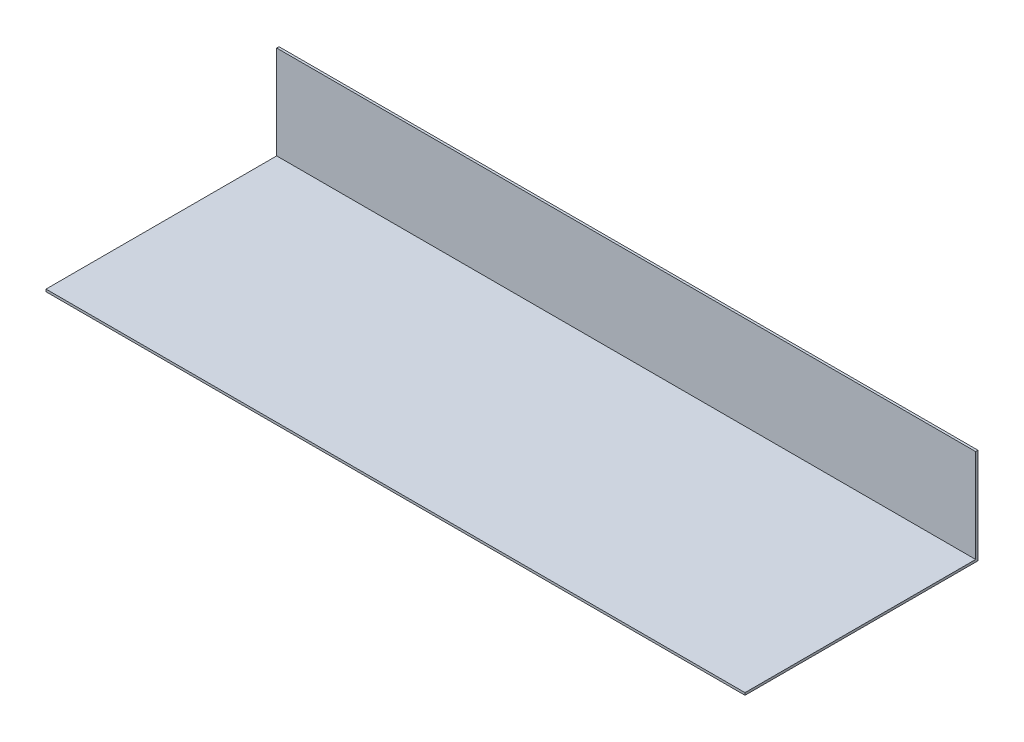
ISO-10303-21;
HEADER;
FILE_DESCRIPTION(('STEP AP214'),'2;1');
FILE_NAME('part.step','',(''),(''),'','','');
FILE_SCHEMA(('AUTOMOTIVE_DESIGN { 1 0 10303 214 1 1 1 1 }'));
ENDSEC;
DATA;
#1=APPLICATION_CONTEXT('core data for automotive mechanical design processes');
#2=APPLICATION_PROTOCOL_DEFINITION('international standard','automotive_design',2000,#1);
#3=PRODUCT_CONTEXT('',#1,'mechanical');
#4=PRODUCT('Part','Part','',(#3));
#5=PRODUCT_RELATED_PRODUCT_CATEGORY('part','',(#4));
#6=PRODUCT_DEFINITION_FORMATION('','',#4);
#7=PRODUCT_DEFINITION_CONTEXT('part definition',#1,'design');
#8=PRODUCT_DEFINITION('design','',#6,#7);
#9=PRODUCT_DEFINITION_SHAPE('','',#8);
#10=(LENGTH_UNIT() NAMED_UNIT(*) SI_UNIT(.MILLI.,.METRE.));
#11=(NAMED_UNIT(*) PLANE_ANGLE_UNIT() SI_UNIT($,.RADIAN.));
#12=(NAMED_UNIT(*) SI_UNIT($,.STERADIAN.) SOLID_ANGLE_UNIT());
#13=UNCERTAINTY_MEASURE_WITH_UNIT(LENGTH_MEASURE(1.E-05),#10,'distance_accuracy_value','');
#14=(GEOMETRIC_REPRESENTATION_CONTEXT(3) GLOBAL_UNCERTAINTY_ASSIGNED_CONTEXT((#13)) GLOBAL_UNIT_ASSIGNED_CONTEXT((#10,
#11,#12)) REPRESENTATION_CONTEXT('',''));
#15=CARTESIAN_POINT('',(0.,0.,0.));
#16=DIRECTION('',(0.,0.,1.));
#17=DIRECTION('',(1.,0.,0.));
#18=AXIS2_PLACEMENT_3D('',#15,#16,#17);
#19=CARTESIAN_POINT('',(450.,3.,-150.));
#20=DIRECTION('',(-1.,0.,0.));
#21=DIRECTION('',(0.,0.,1.));
#22=AXIS2_PLACEMENT_3D('',#19,#20,#21);
#23=PLANE('',#22);
#24=DIRECTION('',(0.,0.,-1.));
#25=VECTOR('',#24,1.);
#26=CARTESIAN_POINT('',(450.,0.,-150.));
#27=LINE('',#26,#25);
#28=CARTESIAN_POINT('',(450.,0.,150.));
#29=VERTEX_POINT('',#28);
#30=CARTESIAN_POINT('',(450.,0.,-150.));
#31=VERTEX_POINT('',#30);
#32=EDGE_CURVE('E98',#29,#31,#27,.T.);
#33=ORIENTED_EDGE('',*,*,#32,.T.);
#34=DIRECTION('',(0.,-1.,0.));
#35=VECTOR('',#34,1.);
#36=CARTESIAN_POINT('',(450.,3.,-150.));
#37=LINE('',#36,#35);
#38=CARTESIAN_POINT('',(450.,123.3,-150.));
#39=VERTEX_POINT('',#38);
#40=EDGE_CURVE('E11',#39,#31,#37,.T.);
#41=ORIENTED_EDGE('',*,*,#40,.F.);
#42=DIRECTION('',(0.,0.,-1.));
#43=VECTOR('',#42,1.);
#44=CARTESIAN_POINT('',(450.,123.3,-150.));
#45=LINE('',#44,#43);
#46=CARTESIAN_POINT('',(450.,123.3,-147.));
#47=VERTEX_POINT('',#46);
#48=EDGE_CURVE('E134',#47,#39,#45,.T.);
#49=ORIENTED_EDGE('',*,*,#48,.F.);
#50=DIRECTION('',(0.,-1.,0.));
#51=VECTOR('',#50,1.);
#52=CARTESIAN_POINT('',(450.,123.3,-147.));
#53=LINE('',#52,#51);
#54=CARTESIAN_POINT('',(450.,3.,-147.));
#55=VERTEX_POINT('',#54);
#56=EDGE_CURVE('E107',#47,#55,#53,.T.);
#57=ORIENTED_EDGE('',*,*,#56,.T.);
#58=DIRECTION('',(0.,0.,-1.));
#59=VECTOR('',#58,1.);
#60=CARTESIAN_POINT('',(450.,3.,-150.));
#61=LINE('',#60,#59);
#62=CARTESIAN_POINT('',(450.,3.,150.));
#63=VERTEX_POINT('',#62);
#64=EDGE_CURVE('E92',#63,#55,#61,.T.);
#65=ORIENTED_EDGE('',*,*,#64,.F.);
#66=DIRECTION('',(0.,-1.,0.));
#67=VECTOR('',#66,1.);
#68=CARTESIAN_POINT('',(450.,3.,150.));
#69=LINE('',#68,#67);
#70=EDGE_CURVE('E85',#63,#29,#69,.T.);
#71=ORIENTED_EDGE('',*,*,#70,.T.);
#72=EDGE_LOOP('',(#33,#41,#49,#57,#65,#71));
#73=FACE_BOUND('',#72,.T.);
#74=ADVANCED_FACE('F43',(#73),#23,.F.);
#75=CARTESIAN_POINT('',(-450.,3.,-150.));
#76=DIRECTION('',(0.,0.,1.));
#77=DIRECTION('',(1.,0.,0.));
#78=AXIS2_PLACEMENT_3D('',#75,#76,#77);
#79=PLANE('',#78);
#80=DIRECTION('',(-1.,0.,0.));
#81=VECTOR('',#80,1.);
#82=CARTESIAN_POINT('',(-450.,0.,-150.));
#83=LINE('',#82,#81);
#84=CARTESIAN_POINT('',(-450.,0.,-150.));
#85=VERTEX_POINT('',#84);
#86=EDGE_CURVE('E102',#31,#85,#83,.T.);
#87=ORIENTED_EDGE('',*,*,#86,.T.);
#88=DIRECTION('',(0.,-1.,0.));
#89=VECTOR('',#88,1.);
#90=CARTESIAN_POINT('',(-450.,3.,-150.));
#91=LINE('',#90,#89);
#92=CARTESIAN_POINT('',(-450.,123.3,-150.));
#93=VERTEX_POINT('',#92);
#94=EDGE_CURVE('E50',#93,#85,#91,.T.);
#95=ORIENTED_EDGE('',*,*,#94,.F.);
#96=DIRECTION('',(-1.,0.,0.));
#97=VECTOR('',#96,1.);
#98=CARTESIAN_POINT('',(-450.,123.3,-150.));
#99=LINE('',#98,#97);
#100=EDGE_CURVE('E126',#39,#93,#99,.T.);
#101=ORIENTED_EDGE('',*,*,#100,.F.);
#102=ORIENTED_EDGE('',*,*,#40,.T.);
#103=EDGE_LOOP('',(#87,#95,#101,#102));
#104=FACE_BOUND('',#103,.T.);
#105=ADVANCED_FACE('F124',(#104),#79,.F.);
#106=CARTESIAN_POINT('',(-450.,3.,-150.));
#107=DIRECTION('',(1.,0.,0.));
#108=DIRECTION('',(0.,0.,-1.));
#109=AXIS2_PLACEMENT_3D('',#106,#107,#108);
#110=PLANE('',#109);
#111=DIRECTION('',(0.,0.,1.));
#112=VECTOR('',#111,1.);
#113=CARTESIAN_POINT('',(-450.,0.,-150.));
#114=LINE('',#113,#112);
#115=CARTESIAN_POINT('',(-450.,0.,150.));
#116=VERTEX_POINT('',#115);
#117=EDGE_CURVE('E93',#85,#116,#114,.T.);
#118=ORIENTED_EDGE('',*,*,#117,.T.);
#119=DIRECTION('',(0.,-1.,0.));
#120=VECTOR('',#119,1.);
#121=CARTESIAN_POINT('',(-450.,3.,150.));
#122=LINE('',#121,#120);
#123=CARTESIAN_POINT('',(-450.,3.,150.));
#124=VERTEX_POINT('',#123);
#125=EDGE_CURVE('E88',#124,#116,#122,.T.);
#126=ORIENTED_EDGE('',*,*,#125,.F.);
#127=DIRECTION('',(0.,0.,1.));
#128=VECTOR('',#127,1.);
#129=CARTESIAN_POINT('',(-450.,3.,-150.));
#130=LINE('',#129,#128);
#131=CARTESIAN_POINT('',(-450.,3.,-147.));
#132=VERTEX_POINT('',#131);
#133=EDGE_CURVE('E142',#132,#124,#130,.T.);
#134=ORIENTED_EDGE('',*,*,#133,.F.);
#135=DIRECTION('',(0.,-1.,0.));
#136=VECTOR('',#135,1.);
#137=CARTESIAN_POINT('',(-450.,123.3,-147.));
#138=LINE('',#137,#136);
#139=CARTESIAN_POINT('',(-450.,123.3,-147.));
#140=VERTEX_POINT('',#139);
#141=EDGE_CURVE('E103',#140,#132,#138,.T.);
#142=ORIENTED_EDGE('',*,*,#141,.F.);
#143=DIRECTION('',(0.,0.,1.));
#144=VECTOR('',#143,1.);
#145=CARTESIAN_POINT('',(-450.,123.3,-150.));
#146=LINE('',#145,#144);
#147=EDGE_CURVE('E120',#93,#140,#146,.T.);
#148=ORIENTED_EDGE('',*,*,#147,.F.);
#149=ORIENTED_EDGE('',*,*,#94,.T.);
#150=EDGE_LOOP('',(#118,#126,#134,#142,#148,#149));
#151=FACE_BOUND('',#150,.T.);
#152=ADVANCED_FACE('F117',(#151),#110,.F.);
#153=CARTESIAN_POINT('',(-450.,3.,150.));
#154=DIRECTION('',(0.,0.,-1.));
#155=DIRECTION('',(-1.,0.,0.));
#156=AXIS2_PLACEMENT_3D('',#153,#154,#155);
#157=PLANE('',#156);
#158=DIRECTION('',(1.,0.,0.));
#159=VECTOR('',#158,1.);
#160=CARTESIAN_POINT('',(-450.,0.,150.));
#161=LINE('',#160,#159);
#162=EDGE_CURVE('E82',#116,#29,#161,.T.);
#163=ORIENTED_EDGE('',*,*,#162,.T.);
#164=ORIENTED_EDGE('',*,*,#70,.F.);
#165=DIRECTION('',(1.,0.,0.));
#166=VECTOR('',#165,1.);
#167=CARTESIAN_POINT('',(-450.,3.,150.));
#168=LINE('',#167,#166);
#169=EDGE_CURVE('E63',#124,#63,#168,.T.);
#170=ORIENTED_EDGE('',*,*,#169,.F.);
#171=ORIENTED_EDGE('',*,*,#125,.T.);
#172=EDGE_LOOP('',(#163,#164,#170,#171));
#173=FACE_BOUND('',#172,.T.);
#174=ADVANCED_FACE('F84',(#173),#157,.F.);
#175=CARTESIAN_POINT('',(0.,3.,0.));
#176=DIRECTION('',(0.,1.,0.));
#177=DIRECTION('',(0.,0.,1.));
#178=AXIS2_PLACEMENT_3D('',#175,#176,#177);
#179=PLANE('',#178);
#180=DIRECTION('',(1.,0.,0.));
#181=VECTOR('',#180,1.);
#182=CARTESIAN_POINT('',(-450.,3.,-147.));
#183=LINE('',#182,#181);
#184=EDGE_CURVE('E57',#132,#55,#183,.T.);
#185=ORIENTED_EDGE('',*,*,#184,.F.);
#186=ORIENTED_EDGE('',*,*,#133,.T.);
#187=ORIENTED_EDGE('',*,*,#169,.T.);
#188=ORIENTED_EDGE('',*,*,#64,.T.);
#189=EDGE_LOOP('',(#185,#186,#187,#188));
#190=FACE_BOUND('',#189,.T.);
#191=ADVANCED_FACE('F143',(#190),#179,.T.);
#192=CARTESIAN_POINT('',(0.,0.,0.));
#193=DIRECTION('',(0.,1.,0.));
#194=DIRECTION('',(0.,0.,1.));
#195=AXIS2_PLACEMENT_3D('',#192,#193,#194);
#196=PLANE('',#195);
#197=ORIENTED_EDGE('',*,*,#32,.F.);
#198=ORIENTED_EDGE('',*,*,#162,.F.);
#199=ORIENTED_EDGE('',*,*,#117,.F.);
#200=ORIENTED_EDGE('',*,*,#86,.F.);
#201=EDGE_LOOP('',(#197,#198,#199,#200));
#202=FACE_BOUND('',#201,.T.);
#203=ADVANCED_FACE('F101',(#202),#196,.F.);
#204=CARTESIAN_POINT('',(-450.,123.3,-147.));
#205=DIRECTION('',(0.,0.,-1.));
#206=DIRECTION('',(-1.,0.,0.));
#207=AXIS2_PLACEMENT_3D('',#204,#205,#206);
#208=PLANE('',#207);
#209=ORIENTED_EDGE('',*,*,#184,.T.);
#210=ORIENTED_EDGE('',*,*,#56,.F.);
#211=DIRECTION('',(1.,0.,0.));
#212=VECTOR('',#211,1.);
#213=CARTESIAN_POINT('',(-450.,123.3,-147.));
#214=LINE('',#213,#212);
#215=EDGE_CURVE('E137',#140,#47,#214,.T.);
#216=ORIENTED_EDGE('',*,*,#215,.F.);
#217=ORIENTED_EDGE('',*,*,#141,.T.);
#218=EDGE_LOOP('',(#209,#210,#216,#217));
#219=FACE_BOUND('',#218,.T.);
#220=ADVANCED_FACE('F146',(#219),#208,.F.);
#221=CARTESIAN_POINT('',(0.,123.3,0.));
#222=DIRECTION('',(0.,1.,0.));
#223=DIRECTION('',(0.,0.,1.));
#224=AXIS2_PLACEMENT_3D('',#221,#222,#223);
#225=PLANE('',#224);
#226=ORIENTED_EDGE('',*,*,#147,.T.);
#227=ORIENTED_EDGE('',*,*,#215,.T.);
#228=ORIENTED_EDGE('',*,*,#48,.T.);
#229=ORIENTED_EDGE('',*,*,#100,.T.);
#230=EDGE_LOOP('',(#226,#227,#228,#229));
#231=FACE_BOUND('',#230,.T.);
#232=ADVANCED_FACE('F130',(#231),#225,.T.);
#233=CLOSED_SHELL('',(#74,#105,#152,#174,#191,#203,#220,#232));
#234=MANIFOLD_SOLID_BREP('B2',#233);
#235=ADVANCED_BREP_SHAPE_REPRESENTATION('',(#18,#234),#14);
#236=SHAPE_DEFINITION_REPRESENTATION(#9,#235);
ENDSEC;
END-ISO-10303-21;
